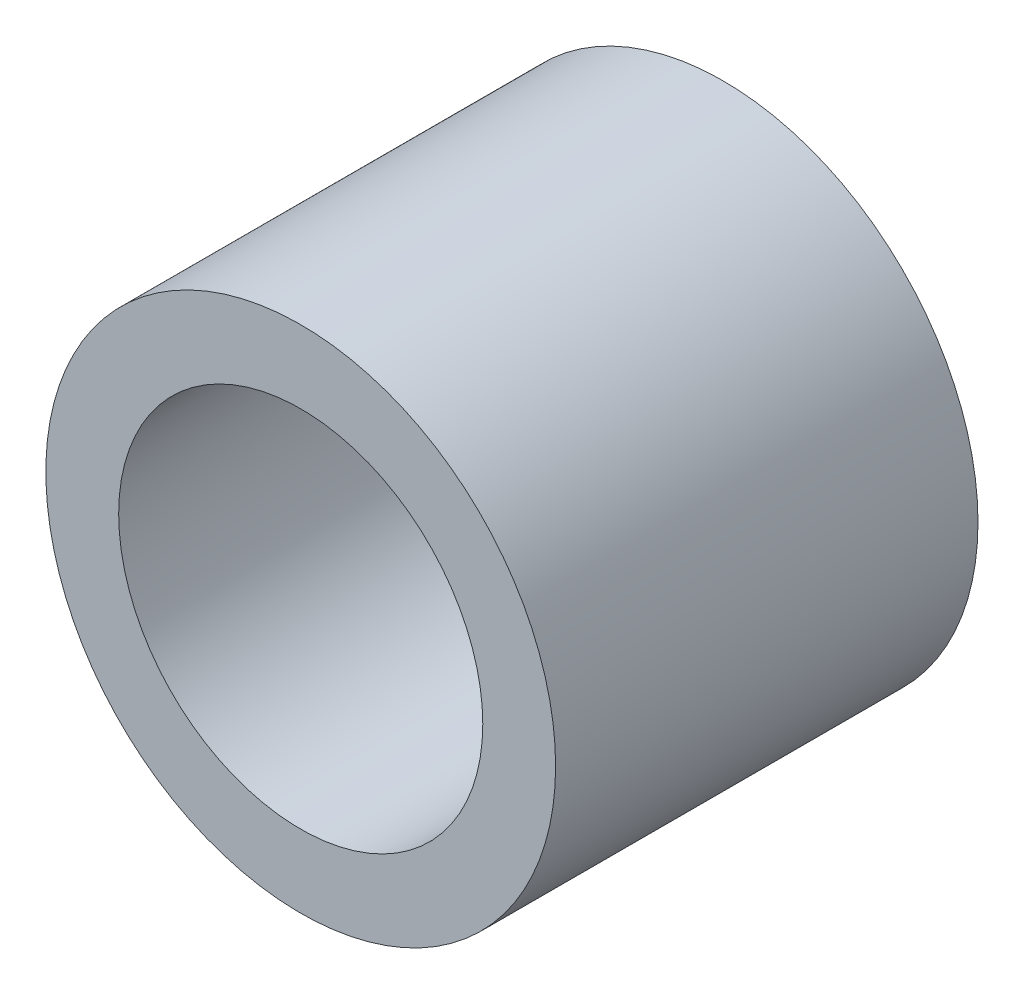
ISO-10303-21;
HEADER;
FILE_DESCRIPTION(('STEP AP214'),'2;1');
FILE_NAME('part.step','',(''),(''),'','','');
FILE_SCHEMA(('AUTOMOTIVE_DESIGN { 1 0 10303 214 1 1 1 1 }'));
ENDSEC;
DATA;
#1=APPLICATION_CONTEXT('core data for automotive mechanical design processes');
#2=APPLICATION_PROTOCOL_DEFINITION('international standard','automotive_design',2000,#1);
#3=PRODUCT_CONTEXT('',#1,'mechanical');
#4=PRODUCT('Part','Part','',(#3));
#5=PRODUCT_RELATED_PRODUCT_CATEGORY('part','',(#4));
#6=PRODUCT_DEFINITION_FORMATION('','',#4);
#7=PRODUCT_DEFINITION_CONTEXT('part definition',#1,'design');
#8=PRODUCT_DEFINITION('design','',#6,#7);
#9=PRODUCT_DEFINITION_SHAPE('','',#8);
#10=(LENGTH_UNIT() NAMED_UNIT(*) SI_UNIT(.MILLI.,.METRE.));
#11=(NAMED_UNIT(*) PLANE_ANGLE_UNIT() SI_UNIT($,.RADIAN.));
#12=(NAMED_UNIT(*) SI_UNIT($,.STERADIAN.) SOLID_ANGLE_UNIT());
#13=UNCERTAINTY_MEASURE_WITH_UNIT(LENGTH_MEASURE(1.E-05),#10,'distance_accuracy_value','');
#14=(GEOMETRIC_REPRESENTATION_CONTEXT(3) GLOBAL_UNCERTAINTY_ASSIGNED_CONTEXT((#13)) GLOBAL_UNIT_ASSIGNED_CONTEXT((#10,
#11,#12)) REPRESENTATION_CONTEXT('',''));
#15=CARTESIAN_POINT('',(0.,0.,0.));
#16=DIRECTION('',(0.,0.,1.));
#17=DIRECTION('',(1.,0.,0.));
#18=AXIS2_PLACEMENT_3D('',#15,#16,#17);
#19=CARTESIAN_POINT('',(0.,0.,22.098));
#20=DIRECTION('',(0.,0.,1.));
#21=DIRECTION('',(1.,0.,0.));
#22=AXIS2_PLACEMENT_3D('',#19,#20,#21);
#23=PLANE('',#22);
#24=CARTESIAN_POINT('',(0.,0.,22.098));
#25=DIRECTION('',(0.,0.,1.));
#26=DIRECTION('',(1.,0.,0.));
#27=AXIS2_PLACEMENT_3D('',#24,#25,#26);
#28=CIRCLE('',#27,13.335);
#29=CARTESIAN_POINT('',(13.335,0.,22.098));
#30=VERTEX_POINT('',#29);
#31=EDGE_CURVE('E10',#30,#30,#28,.T.);
#32=ORIENTED_EDGE('',*,*,#31,.T.);
#33=EDGE_LOOP('',(#32));
#34=FACE_BOUND('',#33,.T.);
#35=CARTESIAN_POINT('',(0.,0.,22.098));
#36=DIRECTION('',(0.,0.,1.));
#37=DIRECTION('',(1.,0.,0.));
#38=AXIS2_PLACEMENT_3D('',#35,#36,#37);
#39=CIRCLE('',#38,9.525);
#40=CARTESIAN_POINT('',(9.525,0.,22.098));
#41=VERTEX_POINT('',#40);
#42=EDGE_CURVE('E43',#41,#41,#39,.T.);
#43=ORIENTED_EDGE('',*,*,#42,.F.);
#44=EDGE_LOOP('',(#43));
#45=FACE_BOUND('',#44,.T.);
#46=ADVANCED_FACE('F32',(#34,#45),#23,.T.);
#47=CARTESIAN_POINT('',(0.,0.,0.));
#48=DIRECTION('',(0.,0.,1.));
#49=DIRECTION('',(1.,0.,0.));
#50=AXIS2_PLACEMENT_3D('',#47,#48,#49);
#51=PLANE('',#50);
#52=CARTESIAN_POINT('',(0.,0.,0.));
#53=DIRECTION('',(0.,0.,1.));
#54=DIRECTION('',(1.,0.,0.));
#55=AXIS2_PLACEMENT_3D('',#52,#53,#54);
#56=CIRCLE('',#55,13.335);
#57=CARTESIAN_POINT('',(13.335,0.,0.));
#58=VERTEX_POINT('',#57);
#59=EDGE_CURVE('E36',#58,#58,#56,.T.);
#60=ORIENTED_EDGE('',*,*,#59,.F.);
#61=EDGE_LOOP('',(#60));
#62=FACE_BOUND('',#61,.T.);
#63=CARTESIAN_POINT('',(0.,0.,0.));
#64=DIRECTION('',(0.,0.,1.));
#65=DIRECTION('',(1.,0.,0.));
#66=AXIS2_PLACEMENT_3D('',#63,#64,#65);
#67=CIRCLE('',#66,9.525);
#68=CARTESIAN_POINT('',(9.525,0.,0.));
#69=VERTEX_POINT('',#68);
#70=EDGE_CURVE('E45',#69,#69,#67,.T.);
#71=ORIENTED_EDGE('',*,*,#70,.T.);
#72=EDGE_LOOP('',(#71));
#73=FACE_BOUND('',#72,.T.);
#74=ADVANCED_FACE('F55',(#62,#73),#51,.F.);
#75=CARTESIAN_POINT('',(0.,0.,22.098));
#76=DIRECTION('',(0.,0.,-1.));
#77=DIRECTION('',(-1.,0.,0.));
#78=AXIS2_PLACEMENT_3D('',#75,#76,#77);
#79=CYLINDRICAL_SURFACE('',#78,13.335);
#80=ORIENTED_EDGE('',*,*,#31,.F.);
#81=EDGE_LOOP('',(#80));
#82=FACE_BOUND('',#81,.T.);
#83=ORIENTED_EDGE('',*,*,#59,.T.);
#84=EDGE_LOOP('',(#83));
#85=FACE_BOUND('',#84,.T.);
#86=ADVANCED_FACE('F34',(#82,#85),#79,.T.);
#87=CARTESIAN_POINT('',(0.,0.,22.098));
#88=DIRECTION('',(0.,0.,-1.));
#89=DIRECTION('',(-1.,0.,0.));
#90=AXIS2_PLACEMENT_3D('',#87,#88,#89);
#91=CYLINDRICAL_SURFACE('',#90,9.525);
#92=ORIENTED_EDGE('',*,*,#42,.T.);
#93=EDGE_LOOP('',(#92));
#94=FACE_BOUND('',#93,.T.);
#95=ORIENTED_EDGE('',*,*,#70,.F.);
#96=EDGE_LOOP('',(#95));
#97=FACE_BOUND('',#96,.T.);
#98=ADVANCED_FACE('F51',(#94,#97),#91,.F.);
#99=CLOSED_SHELL('',(#46,#74,#86,#98));
#100=MANIFOLD_SOLID_BREP('B2',#99);
#101=ADVANCED_BREP_SHAPE_REPRESENTATION('',(#18,#100),#14);
#102=SHAPE_DEFINITION_REPRESENTATION(#9,#101);
ENDSEC;
END-ISO-10303-21;
